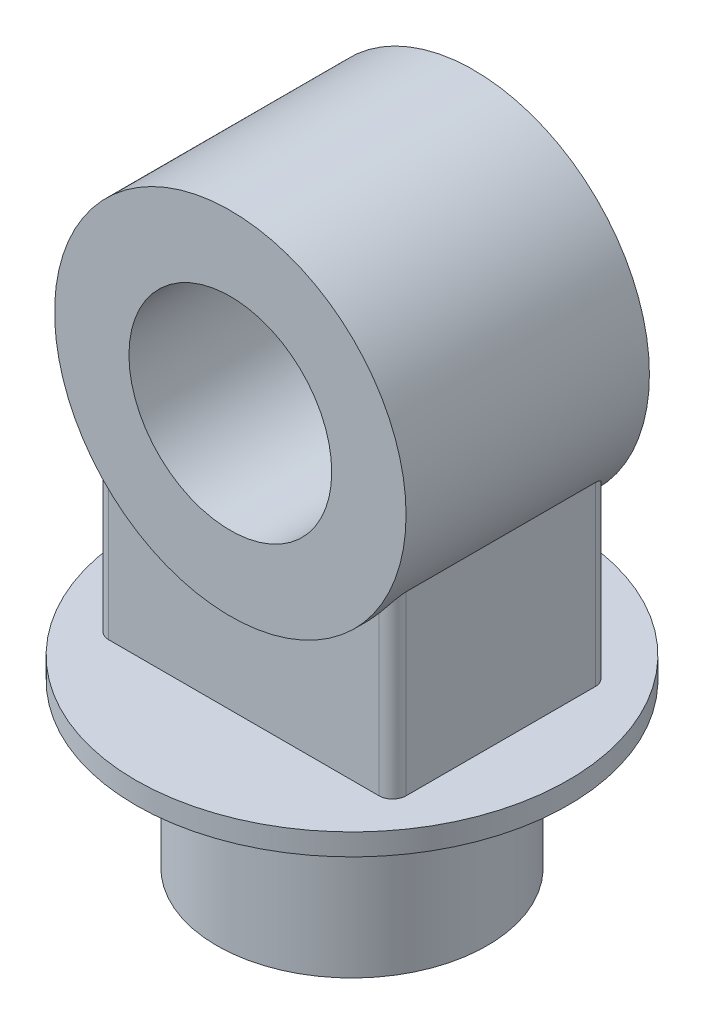
ISO-10303-21;
HEADER;
FILE_DESCRIPTION(('STEP AP214'),'2;1');
FILE_NAME('part.step','',(''),(''),'','','');
FILE_SCHEMA(('AUTOMOTIVE_DESIGN { 1 0 10303 214 1 1 1 1 }'));
ENDSEC;
DATA;
#1=APPLICATION_CONTEXT('core data for automotive mechanical design processes');
#2=APPLICATION_PROTOCOL_DEFINITION('international standard','automotive_design',2000,#1);
#3=PRODUCT_CONTEXT('',#1,'mechanical');
#4=PRODUCT('Part','Part','',(#3));
#5=PRODUCT_RELATED_PRODUCT_CATEGORY('part','',(#4));
#6=PRODUCT_DEFINITION_FORMATION('','',#4);
#7=PRODUCT_DEFINITION_CONTEXT('part definition',#1,'design');
#8=PRODUCT_DEFINITION('design','',#6,#7);
#9=PRODUCT_DEFINITION_SHAPE('','',#8);
#10=(LENGTH_UNIT() NAMED_UNIT(*) SI_UNIT(.MILLI.,.METRE.));
#11=(NAMED_UNIT(*) PLANE_ANGLE_UNIT() SI_UNIT($,.RADIAN.));
#12=(NAMED_UNIT(*) SI_UNIT($,.STERADIAN.) SOLID_ANGLE_UNIT());
#13=UNCERTAINTY_MEASURE_WITH_UNIT(LENGTH_MEASURE(1.E-05),#10,'distance_accuracy_value','');
#14=(GEOMETRIC_REPRESENTATION_CONTEXT(3) GLOBAL_UNCERTAINTY_ASSIGNED_CONTEXT((#13)) GLOBAL_UNIT_ASSIGNED_CONTEXT((#10,
#11,#12)) REPRESENTATION_CONTEXT('',''));
#15=CARTESIAN_POINT('',(0.,0.,0.));
#16=DIRECTION('',(0.,0.,1.));
#17=DIRECTION('',(1.,0.,0.));
#18=AXIS2_PLACEMENT_3D('',#15,#16,#17);
#19=CARTESIAN_POINT('',(0.,120.,0.));
#20=DIRECTION('',(0.,-1.,0.));
#21=DIRECTION('',(0.,0.,-1.));
#22=AXIS2_PLACEMENT_3D('',#19,#20,#21);
#23=CYLINDRICAL_SURFACE('',#22,100.);
#24=CARTESIAN_POINT('',(0.,120.,0.));
#25=DIRECTION('',(0.,1.,0.));
#26=DIRECTION('',(0.,0.,1.));
#27=AXIS2_PLACEMENT_3D('',#24,#25,#26);
#28=CIRCLE('',#27,100.);
#29=CARTESIAN_POINT('',(0.,120.,100.));
#30=VERTEX_POINT('',#29);
#31=EDGE_CURVE('E131',#30,#30,#28,.T.);
#32=ORIENTED_EDGE('',*,*,#31,.F.);
#33=EDGE_LOOP('',(#32));
#34=FACE_BOUND('',#33,.T.);
#35=CARTESIAN_POINT('',(0.,0.,0.));
#36=DIRECTION('',(0.,1.,0.));
#37=DIRECTION('',(0.,0.,1.));
#38=AXIS2_PLACEMENT_3D('',#35,#36,#37);
#39=CIRCLE('',#38,100.);
#40=CARTESIAN_POINT('',(0.,0.,100.));
#41=VERTEX_POINT('',#40);
#42=EDGE_CURVE('E248',#41,#41,#39,.T.);
#43=ORIENTED_EDGE('',*,*,#42,.T.);
#44=EDGE_LOOP('',(#43));
#45=FACE_BOUND('',#44,.T.);
#46=ADVANCED_FACE('F46',(#34,#45),#23,.T.);
#47=CARTESIAN_POINT('',(0.,0.,0.));
#48=DIRECTION('',(0.,1.,0.));
#49=DIRECTION('',(0.,0.,1.));
#50=AXIS2_PLACEMENT_3D('',#47,#48,#49);
#51=PLANE('',#50);
#52=ORIENTED_EDGE('',*,*,#42,.F.);
#53=EDGE_LOOP('',(#52));
#54=FACE_BOUND('',#53,.T.);
#55=ADVANCED_FACE('F201',(#54),#51,.F.);
#56=CARTESIAN_POINT('',(0.,136.,0.));
#57=DIRECTION('',(0.,-1.,0.));
#58=DIRECTION('',(0.,0.,-1.));
#59=AXIS2_PLACEMENT_3D('',#56,#57,#58);
#60=CYLINDRICAL_SURFACE('',#59,160.);
#61=CARTESIAN_POINT('',(0.,136.,0.));
#62=DIRECTION('',(0.,1.,0.));
#63=DIRECTION('',(0.,0.,1.));
#64=AXIS2_PLACEMENT_3D('',#61,#62,#63);
#65=CIRCLE('',#64,160.);
#66=CARTESIAN_POINT('',(0.,136.,160.));
#67=VERTEX_POINT('',#66);
#68=EDGE_CURVE('E252',#67,#67,#65,.T.);
#69=ORIENTED_EDGE('',*,*,#68,.F.);
#70=EDGE_LOOP('',(#69));
#71=FACE_BOUND('',#70,.T.);
#72=CARTESIAN_POINT('',(0.,120.,0.));
#73=DIRECTION('',(0.,1.,0.));
#74=DIRECTION('',(0.,0.,1.));
#75=AXIS2_PLACEMENT_3D('',#72,#73,#74);
#76=CIRCLE('',#75,160.);
#77=CARTESIAN_POINT('',(0.,120.,160.));
#78=VERTEX_POINT('',#77);
#79=EDGE_CURVE('E256',#78,#78,#76,.T.);
#80=ORIENTED_EDGE('',*,*,#79,.T.);
#81=EDGE_LOOP('',(#80));
#82=FACE_BOUND('',#81,.T.);
#83=ADVANCED_FACE('F207',(#71,#82),#60,.T.);
#84=CARTESIAN_POINT('',(0.,136.,0.));
#85=DIRECTION('',(0.,1.,0.));
#86=DIRECTION('',(0.,0.,1.));
#87=AXIS2_PLACEMENT_3D('',#84,#85,#86);
#88=PLANE('',#87);
#89=DIRECTION('',(0.,0.,-1.));
#90=VECTOR('',#89,1.);
#91=CARTESIAN_POINT('',(110.,136.,-80.));
#92=LINE('',#91,#90);
#93=CARTESIAN_POINT('',(110.,136.,70.));
#94=VERTEX_POINT('',#93);
#95=CARTESIAN_POINT('',(110.,136.,-70.));
#96=VERTEX_POINT('',#95);
#97=EDGE_CURVE('E273',#94,#96,#92,.T.);
#98=ORIENTED_EDGE('',*,*,#97,.F.);
#99=CARTESIAN_POINT('',(100.,136.,70.));
#100=DIRECTION('',(0.,1.,0.));
#101=DIRECTION('',(0.,0.,1.));
#102=AXIS2_PLACEMENT_3D('',#99,#100,#101);
#103=CIRCLE('',#102,10.);
#104=CARTESIAN_POINT('',(100.,136.,80.));
#105=VERTEX_POINT('',#104);
#106=EDGE_CURVE('E61',#94,#105,#103,.F.);
#107=ORIENTED_EDGE('',*,*,#106,.T.);
#108=DIRECTION('',(1.,0.,0.));
#109=VECTOR('',#108,1.);
#110=CARTESIAN_POINT('',(-110.,136.,80.));
#111=LINE('',#110,#109);
#112=CARTESIAN_POINT('',(-100.,136.,80.));
#113=VERTEX_POINT('',#112);
#114=EDGE_CURVE('E276',#113,#105,#111,.T.);
#115=ORIENTED_EDGE('',*,*,#114,.F.);
#116=CARTESIAN_POINT('',(-100.,136.,70.));
#117=DIRECTION('',(0.,1.,0.));
#118=DIRECTION('',(0.,0.,1.));
#119=AXIS2_PLACEMENT_3D('',#116,#117,#118);
#120=CIRCLE('',#119,10.);
#121=CARTESIAN_POINT('',(-110.,136.,70.));
#122=VERTEX_POINT('',#121);
#123=EDGE_CURVE('E150',#113,#122,#120,.F.);
#124=ORIENTED_EDGE('',*,*,#123,.T.);
#125=DIRECTION('',(0.,0.,1.));
#126=VECTOR('',#125,1.);
#127=CARTESIAN_POINT('',(-110.,136.,-80.));
#128=LINE('',#127,#126);
#129=CARTESIAN_POINT('',(-110.,136.,-70.));
#130=VERTEX_POINT('',#129);
#131=EDGE_CURVE('E126',#130,#122,#128,.T.);
#132=ORIENTED_EDGE('',*,*,#131,.F.);
#133=CARTESIAN_POINT('',(-100.,136.,-70.));
#134=DIRECTION('',(0.,1.,0.));
#135=DIRECTION('',(0.,0.,1.));
#136=AXIS2_PLACEMENT_3D('',#133,#134,#135);
#137=CIRCLE('',#136,10.);
#138=CARTESIAN_POINT('',(-100.,136.,-80.));
#139=VERTEX_POINT('',#138);
#140=EDGE_CURVE('E225',#130,#139,#137,.F.);
#141=ORIENTED_EDGE('',*,*,#140,.T.);
#142=DIRECTION('',(-1.,0.,0.));
#143=VECTOR('',#142,1.);
#144=CARTESIAN_POINT('',(-110.,136.,-80.));
#145=LINE('',#144,#143);
#146=CARTESIAN_POINT('',(100.,136.,-80.));
#147=VERTEX_POINT('',#146);
#148=EDGE_CURVE('E272',#147,#139,#145,.T.);
#149=ORIENTED_EDGE('',*,*,#148,.F.);
#150=CARTESIAN_POINT('',(100.,136.,-70.));
#151=DIRECTION('',(0.,1.,0.));
#152=DIRECTION('',(0.,0.,1.));
#153=AXIS2_PLACEMENT_3D('',#150,#151,#152);
#154=CIRCLE('',#153,10.);
#155=EDGE_CURVE('E68',#147,#96,#154,.F.);
#156=ORIENTED_EDGE('',*,*,#155,.T.);
#157=EDGE_LOOP('',(#98,#107,#115,#124,#132,#141,#149,#156));
#158=FACE_BOUND('',#157,.T.);
#159=ORIENTED_EDGE('',*,*,#68,.T.);
#160=EDGE_LOOP('',(#159));
#161=FACE_BOUND('',#160,.T.);
#162=ADVANCED_FACE('F331',(#158,#161),#88,.T.);
#163=CARTESIAN_POINT('',(0.,120.,0.));
#164=DIRECTION('',(0.,1.,0.));
#165=DIRECTION('',(0.,0.,1.));
#166=AXIS2_PLACEMENT_3D('',#163,#164,#165);
#167=PLANE('',#166);
#168=ORIENTED_EDGE('',*,*,#31,.T.);
#169=EDGE_LOOP('',(#168));
#170=FACE_BOUND('',#169,.T.);
#171=ORIENTED_EDGE('',*,*,#79,.F.);
#172=EDGE_LOOP('',(#171));
#173=FACE_BOUND('',#172,.T.);
#174=ADVANCED_FACE('F336',(#170,#173),#167,.F.);
#175=CARTESIAN_POINT('',(-110.,466.002,-80.));
#176=DIRECTION('',(0.,0.,1.));
#177=DIRECTION('',(1.,0.,0.));
#178=AXIS2_PLACEMENT_3D('',#175,#176,#177);
#179=PLANE('',#178);
#180=ORIENTED_EDGE('',*,*,#148,.T.);
#181=DIRECTION('',(0.,-1.,0.));
#182=VECTOR('',#181,1.);
#183=CARTESIAN_POINT('',(-100.,466.002,-80.));
#184=LINE('',#183,#182);
#185=CARTESIAN_POINT('',(-100.,252.933761370819,-80.));
#186=VERTEX_POINT('',#185);
#187=EDGE_CURVE('E223',#139,#186,#184,.F.);
#188=ORIENTED_EDGE('',*,*,#187,.T.);
#189=CARTESIAN_POINT('',(0.,336.,-80.));
#190=DIRECTION('',(0.,0.,1.));
#191=DIRECTION('',(1.,0.,0.));
#192=AXIS2_PLACEMENT_3D('',#189,#190,#191);
#193=CIRCLE('',#192,130.);
#194=CARTESIAN_POINT('',(100.,252.933761370819,-80.));
#195=VERTEX_POINT('',#194);
#196=EDGE_CURVE('E142',#186,#195,#193,.T.);
#197=ORIENTED_EDGE('',*,*,#196,.T.);
#198=DIRECTION('',(0.,-1.,0.));
#199=VECTOR('',#198,1.);
#200=CARTESIAN_POINT('',(100.,466.002,-80.));
#201=LINE('',#200,#199);
#202=EDGE_CURVE('E242',#195,#147,#201,.T.);
#203=ORIENTED_EDGE('',*,*,#202,.T.);
#204=EDGE_LOOP('',(#180,#188,#197,#203));
#205=FACE_BOUND('',#204,.T.);
#206=ADVANCED_FACE('F175',(#205),#179,.F.);
#207=CARTESIAN_POINT('',(-110.,466.002,-80.));
#208=DIRECTION('',(1.,0.,0.));
#209=DIRECTION('',(0.,0.,-1.));
#210=AXIS2_PLACEMENT_3D('',#207,#208,#209);
#211=PLANE('',#210);
#212=DIRECTION('',(0.,0.,1.));
#213=VECTOR('',#212,1.);
#214=CARTESIAN_POINT('',(-110.,266.717967697245,-90.));
#215=LINE('',#214,#213);
#216=CARTESIAN_POINT('',(-110.,266.717967697245,70.));
#217=VERTEX_POINT('',#216);
#218=CARTESIAN_POINT('',(-110.,266.717967697245,-70.));
#219=VERTEX_POINT('',#218);
#220=EDGE_CURVE('E123',#217,#219,#215,.F.);
#221=ORIENTED_EDGE('',*,*,#220,.T.);
#222=DIRECTION('',(0.,-1.,0.));
#223=VECTOR('',#222,1.);
#224=CARTESIAN_POINT('',(-110.,466.002,-70.));
#225=LINE('',#224,#223);
#226=EDGE_CURVE('E130',#219,#130,#225,.T.);
#227=ORIENTED_EDGE('',*,*,#226,.T.);
#228=ORIENTED_EDGE('',*,*,#131,.T.);
#229=DIRECTION('',(0.,-1.,0.));
#230=VECTOR('',#229,1.);
#231=CARTESIAN_POINT('',(-110.,466.002,70.));
#232=LINE('',#231,#230);
#233=EDGE_CURVE('E119',#122,#217,#232,.F.);
#234=ORIENTED_EDGE('',*,*,#233,.T.);
#235=EDGE_LOOP('',(#221,#227,#228,#234));
#236=FACE_BOUND('',#235,.T.);
#237=ADVANCED_FACE('F121',(#236),#211,.F.);
#238=CARTESIAN_POINT('',(110.,466.002,-80.));
#239=DIRECTION('',(-1.,0.,0.));
#240=DIRECTION('',(0.,0.,1.));
#241=AXIS2_PLACEMENT_3D('',#238,#239,#240);
#242=PLANE('',#241);
#243=ORIENTED_EDGE('',*,*,#97,.T.);
#244=DIRECTION('',(0.,-1.,0.));
#245=VECTOR('',#244,1.);
#246=CARTESIAN_POINT('',(110.,466.002,-70.));
#247=LINE('',#246,#245);
#248=CARTESIAN_POINT('',(110.,266.717967697245,-70.));
#249=VERTEX_POINT('',#248);
#250=EDGE_CURVE('E227',#96,#249,#247,.F.);
#251=ORIENTED_EDGE('',*,*,#250,.T.);
#252=DIRECTION('',(0.,0.,1.));
#253=VECTOR('',#252,1.);
#254=CARTESIAN_POINT('',(110.,266.717967697245,-90.));
#255=LINE('',#254,#253);
#256=CARTESIAN_POINT('',(110.,266.717967697245,70.));
#257=VERTEX_POINT('',#256);
#258=EDGE_CURVE('E260',#249,#257,#255,.T.);
#259=ORIENTED_EDGE('',*,*,#258,.T.);
#260=DIRECTION('',(0.,-1.,0.));
#261=VECTOR('',#260,1.);
#262=CARTESIAN_POINT('',(110.,466.002,70.));
#263=LINE('',#262,#261);
#264=EDGE_CURVE('E230',#257,#94,#263,.T.);
#265=ORIENTED_EDGE('',*,*,#264,.T.);
#266=EDGE_LOOP('',(#243,#251,#259,#265));
#267=FACE_BOUND('',#266,.T.);
#268=ADVANCED_FACE('F358',(#267),#242,.F.);
#269=CARTESIAN_POINT('',(-110.,466.002,80.));
#270=DIRECTION('',(0.,0.,-1.));
#271=DIRECTION('',(-1.,0.,0.));
#272=AXIS2_PLACEMENT_3D('',#269,#270,#271);
#273=PLANE('',#272);
#274=CARTESIAN_POINT('',(0.,336.,80.));
#275=DIRECTION('',(0.,0.,-1.));
#276=DIRECTION('',(-1.,0.,0.));
#277=AXIS2_PLACEMENT_3D('',#274,#275,#276);
#278=CIRCLE('',#277,130.);
#279=CARTESIAN_POINT('',(100.,252.933761370819,80.));
#280=VERTEX_POINT('',#279);
#281=CARTESIAN_POINT('',(-100.,252.933761370819,80.));
#282=VERTEX_POINT('',#281);
#283=EDGE_CURVE('E143',#280,#282,#278,.T.);
#284=ORIENTED_EDGE('',*,*,#283,.T.);
#285=DIRECTION('',(0.,-1.,0.));
#286=VECTOR('',#285,1.);
#287=CARTESIAN_POINT('',(-100.,466.002,80.));
#288=LINE('',#287,#286);
#289=EDGE_CURVE('E148',#282,#113,#288,.T.);
#290=ORIENTED_EDGE('',*,*,#289,.T.);
#291=ORIENTED_EDGE('',*,*,#114,.T.);
#292=DIRECTION('',(0.,-1.,0.));
#293=VECTOR('',#292,1.);
#294=CARTESIAN_POINT('',(100.,466.002,80.));
#295=LINE('',#294,#293);
#296=EDGE_CURVE('E237',#105,#280,#295,.F.);
#297=ORIENTED_EDGE('',*,*,#296,.T.);
#298=EDGE_LOOP('',(#284,#290,#291,#297));
#299=FACE_BOUND('',#298,.T.);
#300=ADVANCED_FACE('F171',(#299),#273,.F.);
#301=CARTESIAN_POINT('',(0.,336.,-90.));
#302=DIRECTION('',(0.,0.,1.));
#303=DIRECTION('',(1.,0.,0.));
#304=AXIS2_PLACEMENT_3D('',#301,#302,#303);
#305=CYLINDRICAL_SURFACE('',#304,130.);
#306=CARTESIAN_POINT('',(0.,336.,90.));
#307=DIRECTION('',(0.,0.,1.));
#308=DIRECTION('',(1.,0.,0.));
#309=AXIS2_PLACEMENT_3D('',#306,#307,#308);
#310=CIRCLE('',#309,130.);
#311=CARTESIAN_POINT('',(130.,336.,90.));
#312=VERTEX_POINT('',#311);
#313=EDGE_CURVE('E285',#312,#312,#310,.T.);
#314=ORIENTED_EDGE('',*,*,#313,.F.);
#315=EDGE_LOOP('',(#314));
#316=FACE_BOUND('',#315,.T.);
#317=CARTESIAN_POINT('',(0.,336.,-90.));
#318=DIRECTION('',(0.,0.,1.));
#319=DIRECTION('',(1.,0.,0.));
#320=AXIS2_PLACEMENT_3D('',#317,#318,#319);
#321=CIRCLE('',#320,130.);
#322=CARTESIAN_POINT('',(130.,336.,-90.));
#323=VERTEX_POINT('',#322);
#324=EDGE_CURVE('E277',#323,#323,#321,.T.);
#325=ORIENTED_EDGE('',*,*,#324,.T.);
#326=EDGE_LOOP('',(#325));
#327=FACE_BOUND('',#326,.T.);
#328=ORIENTED_EDGE('',*,*,#196,.F.);
#329=CARTESIAN_POINT('',(-100.,252.933761370819,-80.));
#330=CARTESIAN_POINT('',(-100.223611151915,253.202952503255,-79.9999830665315));
#331=CARTESIAN_POINT('',(-100.446118360057,253.473036166024,-79.9924995885084));
#332=CARTESIAN_POINT('',(-100.888548742496,254.014496760122,-79.9629173131463));
#333=CARTESIAN_POINT('',(-101.10847204376,254.285873626978,-79.9408192370115));
#334=CARTESIAN_POINT('',(-101.545586290072,254.829711400373,-79.8822979337703));
#335=CARTESIAN_POINT('',(-101.76277446753,255.102173087004,-79.8458612385231));
#336=CARTESIAN_POINT('',(-102.193849033468,255.647413797012,-79.7588609087488));
#337=CARTESIAN_POINT('',(-102.407735374993,255.920192824843,-79.7082970735217));
#338=CARTESIAN_POINT('',(-103.048408055095,256.74400885936,-79.5343891784366));
#339=CARTESIAN_POINT('',(-103.469748368072,257.294974230618,-79.3894263280957));
#340=CARTESIAN_POINT('',(-104.088382224678,258.117224843771,-79.1288060997197));
#341=CARTESIAN_POINT('',(-104.292337034927,258.39057162742,-79.0347525474724));
#342=CARTESIAN_POINT('',(-104.695498702643,258.935304765081,-78.8319429710981));
#343=CARTESIAN_POINT('',(-104.894706004332,259.206691300842,-78.7231883289499));
#344=CARTESIAN_POINT('',(-105.336170271764,259.812965668139,-78.4620472638272));
#345=CARTESIAN_POINT('',(-105.577006541077,260.147108038148,-78.3055009036512));
#346=CARTESIAN_POINT('',(-106.049660949871,260.809343252621,-77.967808626391));
#347=CARTESIAN_POINT('',(-106.281479043935,261.137436066616,-77.7866625854443));
#348=CARTESIAN_POINT('',(-106.734152264033,261.784259610706,-77.3986376161628));
#349=CARTESIAN_POINT('',(-106.955036134368,262.103013877599,-77.1918317878757));
#350=CARTESIAN_POINT('',(-107.384708325122,262.728803605627,-76.749894392022));
#351=CARTESIAN_POINT('',(-107.593501627276,263.035843875289,-76.5147746155492));
#352=CARTESIAN_POINT('',(-107.921279015409,263.522080966667,-76.1068757916445));
#353=CARTESIAN_POINT('',(-108.044709884718,263.706240813683,-75.9435605188262));
#354=CARTESIAN_POINT('',(-108.284949666933,264.066582834907,-75.6038296157537));
#355=CARTESIAN_POINT('',(-108.401760304956,264.242767084987,-75.4274174262628));
#356=CARTESIAN_POINT('',(-108.627683741988,264.585236991633,-75.0605773993746));
#357=CARTESIAN_POINT('',(-108.736797961361,264.751524473746,-74.8701521613912));
#358=CARTESIAN_POINT('',(-108.945874410432,265.071634412635,-74.4745306992527));
#359=CARTESIAN_POINT('',(-109.04583974995,265.225461102935,-74.2693395369044));
#360=CARTESIAN_POINT('',(-109.274660386151,265.579056080623,-73.7536743100226));
#361=CARTESIAN_POINT('',(-109.398046362816,265.771031349643,-73.4351396850742));
#362=CARTESIAN_POINT('',(-109.561336457207,266.026263049993,-72.9345418523035));
#363=CARTESIAN_POINT('',(-109.612072269395,266.105785634321,-72.7641622498836));
#364=CARTESIAN_POINT('',(-109.705421847597,266.25239837099,-72.4160328323222));
#365=CARTESIAN_POINT('',(-109.748040656091,266.319496241142,-72.2382876769632));
#366=CARTESIAN_POINT('',(-109.820262744001,266.433384610412,-71.8947331689276));
#367=CARTESIAN_POINT('',(-109.850752312767,266.481551609067,-71.729567610939));
#368=CARTESIAN_POINT('',(-109.903691363628,266.565274678988,-71.3948451418075));
#369=CARTESIAN_POINT('',(-109.926143541964,266.600834979285,-71.2252897238033));
#370=CARTESIAN_POINT('',(-109.962659042777,266.658707696818,-70.8807814271977));
#371=CARTESIAN_POINT('',(-109.976613864032,266.680848750137,-70.7057875562757));
#372=CARTESIAN_POINT('',(-109.99061964662,266.703076138542,-70.4419386674802));
#373=CARTESIAN_POINT('',(-109.99413386492,266.708654625172,-70.353690213971));
#374=CARTESIAN_POINT('',(-109.998824989492,266.716102079046,-70.1769662160102));
#375=CARTESIAN_POINT('',(-110.000001659485,266.717970671296,-70.088490649507));
#376=CARTESIAN_POINT('',(-110.,266.717967697245,-70.));
#377=B_SPLINE_CURVE_WITH_KNOTS('',3,(#329,#330,#331,#332,#333,#334,#335,#336,#337,#338,#339,
#340,#341,#342,#343,#344,#345,#346,#347,#348,#349,#350,#351,#352,#353,#354,#355,#356,#357,#358,
#359,#360,#361,#362,#363,#364,#365,#366,#367,#368,#369,#370,#371,#372,#373,#374,#375,#376),
.UNSPECIFIED.,.F.,.F.,(4,2,2,2,2,2,2,2,2,2,2,2,2,2,2,2,2,2,2,2,2,2,2,4),(0.,1.04974156507777,
2.09943133114574,3.15010942417271,4.20080244462032,6.32356278933855,7.38465211465328,
8.44564176134501,9.76677685539399,11.087918601761,12.4053795382949,13.7222937149078,
14.5479419827465,15.3733741023699,16.1986534888326,17.023651302289,18.194686650492,
18.7783719827905,19.3616935243416,19.8852298594993,20.4085904030381,20.9385006934629,
21.2038887699912,21.4693036704869),.UNSPECIFIED.);
#378=EDGE_CURVE('E140',#186,#219,#377,.T.);
#379=ORIENTED_EDGE('',*,*,#378,.T.);
#380=ORIENTED_EDGE('',*,*,#220,.F.);
#381=CARTESIAN_POINT('',(-110.,266.717967697245,70.));
#382=CARTESIAN_POINT('',(-110.000033683462,266.718025852698,70.1614230595313));
#383=CARTESIAN_POINT('',(-109.996092792414,266.711764254296,70.3228118197691));
#384=CARTESIAN_POINT('',(-109.980519982779,266.687045880384,70.6441123999958));
#385=CARTESIAN_POINT('',(-109.968896213713,266.668602027069,70.8040256031146));
#386=CARTESIAN_POINT('',(-109.938376398954,266.620217986395,71.1196424551221));
#387=CARTESIAN_POINT('',(-109.919558261622,266.590400967593,71.2753727040436));
#388=CARTESIAN_POINT('',(-109.875071558334,266.52000006118,71.5834085562727));
#389=CARTESIAN_POINT('',(-109.849400846184,266.479412800404,71.735713070425));
#390=CARTESIAN_POINT('',(-109.784772267017,266.377386983169,72.0722520040974));
#391=CARTESIAN_POINT('',(-109.744103525393,266.313281105856,72.2553511890568));
#392=CARTESIAN_POINT('',(-109.654040532803,266.17165023193,72.6141464391851));
#393=CARTESIAN_POINT('',(-109.604640075501,266.094115691273,72.7898371277865));
#394=CARTESIAN_POINT('',(-109.497968805892,265.927147418338,73.1338723913451));
#395=CARTESIAN_POINT('',(-109.440667457039,265.837667562915,73.302184951541));
#396=CARTESIAN_POINT('',(-109.319341126161,265.648779195145,73.6304969218558));
#397=CARTESIAN_POINT('',(-109.25531768694,265.549372961282,73.7904982269664));
#398=CARTESIAN_POINT('',(-109.085069343255,265.28590129292,74.1868876463209));
#399=CARTESIAN_POINT('',(-108.974781990569,265.115997241409,74.4176642111939));
#400=CARTESIAN_POINT('',(-108.742772943656,264.76058359918,74.8607110351427));
#401=CARTESIAN_POINT('',(-108.621044869784,264.575065307649,75.072970840064));
#402=CARTESIAN_POINT('',(-108.36794946479,264.19164129378,75.4804206329535));
#403=CARTESIAN_POINT('',(-108.236568322626,263.993717884812,75.6755852518653));
#404=CARTESIAN_POINT('',(-107.965814499919,263.588382733387,76.0497203250662));
#405=CARTESIAN_POINT('',(-107.826442440892,263.380971729107,76.2286920360202));
#406=CARTESIAN_POINT('',(-107.56145650763,262.989174407744,76.5468161797372));
#407=CARTESIAN_POINT('',(-107.436764821801,262.805791987749,76.6879854690674));
#408=CARTESIAN_POINT('',(-107.182869679799,262.434497987953,76.9599552926784));
#409=CARTESIAN_POINT('',(-107.053665586411,262.24658576965,77.0907543539386));
#410=CARTESIAN_POINT('',(-106.659844344167,261.677121003612,77.4685356621902));
#411=CARTESIAN_POINT('',(-106.389102445143,261.289965080353,77.7008024816961));
#412=CARTESIAN_POINT('',(-105.833418194947,260.504836154638,78.129863631631));
#413=CARTESIAN_POINT('',(-105.548442441802,260.106838810795,78.3265689888296));
#414=CARTESIAN_POINT('',(-104.96676628824,259.304344779382,78.6860846955172));
#415=CARTESIAN_POINT('',(-104.670068038633,258.899849292081,78.8489012287859));
#416=CARTESIAN_POINT('',(-104.024574509401,258.030646711215,79.1623550419402));
#417=CARTESIAN_POINT('',(-103.674248758637,257.565348460988,79.3081944572229));
#418=CARTESIAN_POINT('',(-102.961876677953,256.632523338709,79.558756520093));
#419=CARTESIAN_POINT('',(-102.599828734006,256.16499616738,79.6634734792563));
#420=CARTESIAN_POINT('',(-102.051092736822,255.466397204689,79.7891645729388));
#421=CARTESIAN_POINT('',(-101.868137468165,255.235094848973,79.8257282191265));
#422=CARTESIAN_POINT('',(-101.499966150616,254.77288550036,79.8886289353229));
#423=CARTESIAN_POINT('',(-101.314750133026,254.541978502041,79.9149661467555));
#424=CARTESIAN_POINT('',(-100.942320486513,254.080919722901,79.9572665465168));
#425=CARTESIAN_POINT('',(-100.755107350153,253.850767773367,79.9732322353467));
#426=CARTESIAN_POINT('',(-100.378860262163,253.391449185777,79.9945948234744));
#427=CARTESIAN_POINT('',(-100.189826234412,253.162282589497,79.9999912789888));
#428=CARTESIAN_POINT('',(-100.,252.933761370819,80.));
#429=B_SPLINE_CURVE_WITH_KNOTS('',3,(#381,#382,#383,#384,#385,#386,#387,#388,#389,#390,#391,
#392,#393,#394,#395,#396,#397,#398,#399,#400,#401,#402,#403,#404,#405,#406,#407,#408,#409,#410,
#411,#412,#413,#414,#415,#416,#417,#418,#419,#420,#421,#422,#423,#424,#425,#426,#427,#428),
.UNSPECIFIED.,.F.,.F.,(4,2,2,2,2,2,2,2,2,2,2,2,2,2,2,2,2,2,2,2,2,2,2,4),(0.,0.484045005923072,
0.967577389145415,1.44601544684505,1.92460352520314,2.51835043890467,3.11252108624073,
3.70905613988738,4.30545457926274,5.22516595363372,6.14539326092332,7.06696382284197,
7.98846280401966,8.77680092000543,9.56525081419905,11.1426900482287,12.7240229357798,
14.305067020047,16.1047501551828,17.9046821508918,18.7960435003637,19.6873925225409,
20.5785265668948,21.4696980275819),.UNSPECIFIED.);
#430=EDGE_CURVE('E137',#217,#282,#429,.T.);
#431=ORIENTED_EDGE('',*,*,#430,.T.);
#432=ORIENTED_EDGE('',*,*,#283,.F.);
#433=CARTESIAN_POINT('',(100.,252.933761370819,80.));
#434=CARTESIAN_POINT('',(100.223611151915,253.202952503255,79.9999830665315));
#435=CARTESIAN_POINT('',(100.446118360057,253.473036166024,79.9924995885085));
#436=CARTESIAN_POINT('',(100.888548742496,254.014496760122,79.9629173131463));
#437=CARTESIAN_POINT('',(101.108472043759,254.285873626978,79.9408192370116));
#438=CARTESIAN_POINT('',(101.545586290072,254.829711400373,79.8822979337704));
#439=CARTESIAN_POINT('',(101.76277446753,255.102173087004,79.8458612385232));
#440=CARTESIAN_POINT('',(102.193849033468,255.647413797012,79.7588609087488));
#441=CARTESIAN_POINT('',(102.407735374993,255.920192824843,79.7082970735218));
#442=CARTESIAN_POINT('',(103.048408055095,256.74400885936,79.5343891784367));
#443=CARTESIAN_POINT('',(103.469748368072,257.294974230618,79.3894263280958));
#444=CARTESIAN_POINT('',(104.088382224678,258.117224843771,79.1288060997198));
#445=CARTESIAN_POINT('',(104.292337034927,258.39057162742,79.0347525474725));
#446=CARTESIAN_POINT('',(104.695498702643,258.935304765081,78.8319429710982));
#447=CARTESIAN_POINT('',(104.894706004332,259.206691300842,78.7231883289499));
#448=CARTESIAN_POINT('',(105.336170271764,259.812965668139,78.4620472638273));
#449=CARTESIAN_POINT('',(105.577006541077,260.147108038148,78.3055009036513));
#450=CARTESIAN_POINT('',(106.04966094987,260.809343252621,77.967808626391));
#451=CARTESIAN_POINT('',(106.281479043935,261.137436066616,77.7866625854444));
#452=CARTESIAN_POINT('',(106.734152264033,261.784259610706,77.3986376161629));
#453=CARTESIAN_POINT('',(106.955036134368,262.103013877598,77.1918317878757));
#454=CARTESIAN_POINT('',(107.384708325122,262.728803605627,76.749894392022));
#455=CARTESIAN_POINT('',(107.593501627276,263.035843875289,76.5147746155493));
#456=CARTESIAN_POINT('',(107.921279015409,263.522080966666,76.1068757916446));
#457=CARTESIAN_POINT('',(108.044709884718,263.706240813682,75.9435605188263));
#458=CARTESIAN_POINT('',(108.284949666933,264.066582834907,75.6038296157539));
#459=CARTESIAN_POINT('',(108.401760304956,264.242767084986,75.4274174262629));
#460=CARTESIAN_POINT('',(108.627683741988,264.585236991633,75.0605773993747));
#461=CARTESIAN_POINT('',(108.736797961361,264.751524473746,74.8701521613913));
#462=CARTESIAN_POINT('',(108.945874410432,265.071634412635,74.4745306992528));
#463=CARTESIAN_POINT('',(109.04583974995,265.225461102935,74.2693395369045));
#464=CARTESIAN_POINT('',(109.274660386151,265.579056080623,73.7536743100227));
#465=CARTESIAN_POINT('',(109.398046362816,265.771031349643,73.4351396850742));
#466=CARTESIAN_POINT('',(109.561336457207,266.026263049992,72.9345418523035));
#467=CARTESIAN_POINT('',(109.612072269395,266.105785634321,72.7641622498837));
#468=CARTESIAN_POINT('',(109.705421847597,266.25239837099,72.4160328323223));
#469=CARTESIAN_POINT('',(109.748040656091,266.319496241142,72.2382876769633));
#470=CARTESIAN_POINT('',(109.820262744001,266.433384610412,71.8947331689276));
#471=CARTESIAN_POINT('',(109.850752312767,266.481551609067,71.729567610939));
#472=CARTESIAN_POINT('',(109.903691363628,266.565274678987,71.3948451418076));
#473=CARTESIAN_POINT('',(109.926143541964,266.600834979285,71.2252897238033));
#474=CARTESIAN_POINT('',(109.962659042777,266.658707696818,70.8807814271978));
#475=CARTESIAN_POINT('',(109.976613864032,266.680848750137,70.7057875562757));
#476=CARTESIAN_POINT('',(109.99061964662,266.703076138542,70.4419386674803));
#477=CARTESIAN_POINT('',(109.99413386492,266.708654625171,70.3536902139711));
#478=CARTESIAN_POINT('',(109.998824989492,266.716102079046,70.1769662160103));
#479=CARTESIAN_POINT('',(110.000001659485,266.717970671296,70.0884906495071));
#480=CARTESIAN_POINT('',(110.,266.717967697245,70.0000000000001));
#481=B_SPLINE_CURVE_WITH_KNOTS('',3,(#433,#434,#435,#436,#437,#438,#439,#440,#441,#442,#443,
#444,#445,#446,#447,#448,#449,#450,#451,#452,#453,#454,#455,#456,#457,#458,#459,#460,#461,#462,
#463,#464,#465,#466,#467,#468,#469,#470,#471,#472,#473,#474,#475,#476,#477,#478,#479,#480),
.UNSPECIFIED.,.F.,.F.,(4,2,2,2,2,2,2,2,2,2,2,2,2,2,2,2,2,2,2,2,2,2,2,4),(0.,1.04974156507776,
2.09943133114567,3.15010942417265,4.20080244462031,6.32356278933861,7.38465211465335,
8.44564176134501,9.76677685539397,11.087918601761,12.4053795382949,13.7222937149077,
14.5479419827463,15.3733741023698,16.1986534888326,17.023651302289,18.194686650492,
18.7783719827905,19.3616935243416,19.8852298594993,20.4085904030381,20.9385006934629,
21.2038887699912,21.4693036704869),.UNSPECIFIED.);
#482=EDGE_CURVE('E11',#280,#257,#481,.T.);
#483=ORIENTED_EDGE('',*,*,#482,.T.);
#484=ORIENTED_EDGE('',*,*,#258,.F.);
#485=CARTESIAN_POINT('',(110.,266.717967697245,-70.));
#486=CARTESIAN_POINT('',(110.000033683462,266.718025852698,-70.1614230595313));
#487=CARTESIAN_POINT('',(109.996092792414,266.711764254296,-70.322811819769));
#488=CARTESIAN_POINT('',(109.980519982779,266.687045880384,-70.6441123999957));
#489=CARTESIAN_POINT('',(109.968896213713,266.668602027069,-70.8040256031146));
#490=CARTESIAN_POINT('',(109.938376398954,266.620217986395,-71.119642455122));
#491=CARTESIAN_POINT('',(109.919558261622,266.590400967593,-71.2753727040436));
#492=CARTESIAN_POINT('',(109.875071558334,266.52000006118,-71.5834085562726));
#493=CARTESIAN_POINT('',(109.849400846184,266.479412800404,-71.7357130704249));
#494=CARTESIAN_POINT('',(109.784772267017,266.377386983169,-72.0722520040974));
#495=CARTESIAN_POINT('',(109.744103525393,266.313281105856,-72.2553511890568));
#496=CARTESIAN_POINT('',(109.654040532803,266.17165023193,-72.6141464391851));
#497=CARTESIAN_POINT('',(109.604640075501,266.094115691273,-72.7898371277865));
#498=CARTESIAN_POINT('',(109.497968805892,265.927147418338,-73.133872391345));
#499=CARTESIAN_POINT('',(109.440667457039,265.837667562915,-73.302184951541));
#500=CARTESIAN_POINT('',(109.319341126161,265.648779195145,-73.6304969218558));
#501=CARTESIAN_POINT('',(109.25531768694,265.549372961282,-73.7904982269664));
#502=CARTESIAN_POINT('',(109.085069343255,265.28590129292,-74.1868876463209));
#503=CARTESIAN_POINT('',(108.974781990569,265.115997241409,-74.4176642111939));
#504=CARTESIAN_POINT('',(108.742772943656,264.76058359918,-74.8607110351426));
#505=CARTESIAN_POINT('',(108.621044869784,264.575065307649,-75.072970840064));
#506=CARTESIAN_POINT('',(108.36794946479,264.19164129378,-75.4804206329535));
#507=CARTESIAN_POINT('',(108.236568322626,263.993717884812,-75.6755852518652));
#508=CARTESIAN_POINT('',(107.965814499919,263.588382733387,-76.0497203250661));
#509=CARTESIAN_POINT('',(107.826442440892,263.380971729107,-76.2286920360201));
#510=CARTESIAN_POINT('',(107.56145650763,262.989174407744,-76.5468161797372));
#511=CARTESIAN_POINT('',(107.436764821801,262.805791987749,-76.6879854690673));
#512=CARTESIAN_POINT('',(107.182869679799,262.434497987953,-76.9599552926783));
#513=CARTESIAN_POINT('',(107.053665586411,262.24658576965,-77.0907543539386));
#514=CARTESIAN_POINT('',(106.659844344167,261.677121003612,-77.4685356621901));
#515=CARTESIAN_POINT('',(106.389102445143,261.289965080353,-77.700802481696));
#516=CARTESIAN_POINT('',(105.833418194947,260.504836154638,-78.1298636316309));
#517=CARTESIAN_POINT('',(105.548442441802,260.106838810795,-78.3265689888295));
#518=CARTESIAN_POINT('',(104.96676628824,259.304344779382,-78.6860846955171));
#519=CARTESIAN_POINT('',(104.670068038633,258.899849292081,-78.8489012287858));
#520=CARTESIAN_POINT('',(104.024574509401,258.030646711215,-79.1623550419402));
#521=CARTESIAN_POINT('',(103.674248758637,257.565348460988,-79.3081944572228));
#522=CARTESIAN_POINT('',(102.961876677953,256.632523338709,-79.5587565200929));
#523=CARTESIAN_POINT('',(102.599828734006,256.16499616738,-79.6634734792563));
#524=CARTESIAN_POINT('',(102.051092736822,255.466397204689,-79.7891645729387));
#525=CARTESIAN_POINT('',(101.868137468165,255.235094848973,-79.8257282191264));
#526=CARTESIAN_POINT('',(101.499966150616,254.77288550036,-79.8886289353229));
#527=CARTESIAN_POINT('',(101.314750133026,254.541978502041,-79.9149661467554));
#528=CARTESIAN_POINT('',(100.942320486513,254.080919722901,-79.9572665465167));
#529=CARTESIAN_POINT('',(100.755107350153,253.850767773367,-79.9732322353467));
#530=CARTESIAN_POINT('',(100.378860262163,253.391449185777,-79.9945948234743));
#531=CARTESIAN_POINT('',(100.189826234412,253.162282589497,-79.9999912789887));
#532=CARTESIAN_POINT('',(100.,252.933761370819,-80.));
#533=B_SPLINE_CURVE_WITH_KNOTS('',3,(#485,#486,#487,#488,#489,#490,#491,#492,#493,#494,#495,
#496,#497,#498,#499,#500,#501,#502,#503,#504,#505,#506,#507,#508,#509,#510,#511,#512,#513,#514,
#515,#516,#517,#518,#519,#520,#521,#522,#523,#524,#525,#526,#527,#528,#529,#530,#531,#532),
.UNSPECIFIED.,.F.,.F.,(4,2,2,2,2,2,2,2,2,2,2,2,2,2,2,2,2,2,2,2,2,2,2,4),(0.,0.484045005923069,
0.96757738914542,1.44601544684505,1.92460352520313,2.51835043890468,3.11252108624078,
3.7090561398874,4.30545457926274,5.22516595363375,6.14539326092329,7.06696382284192,
7.98846280401964,8.77680092000536,9.56525081419895,11.1426900482287,12.7240229357798,
14.305067020047,16.1047501551828,17.9046821508917,18.7960435003637,19.6873925225409,
20.5785265668947,21.4696980275819),.UNSPECIFIED.);
#534=EDGE_CURVE('E154',#249,#195,#533,.T.);
#535=ORIENTED_EDGE('',*,*,#534,.T.);
#536=EDGE_LOOP('',(#328,#379,#380,#431,#432,#483,#484,#535));
#537=FACE_BOUND('',#536,.T.);
#538=ADVANCED_FACE('F135',(#316,#327,#537),#305,.T.);
#539=CARTESIAN_POINT('',(0.,336.,-90.));
#540=DIRECTION('',(0.,0.,1.));
#541=DIRECTION('',(1.,0.,0.));
#542=AXIS2_PLACEMENT_3D('',#539,#540,#541);
#543=PLANE('',#542);
#544=CARTESIAN_POINT('',(0.,336.,-90.));
#545=DIRECTION('',(0.,0.,1.));
#546=DIRECTION('',(1.,0.,0.));
#547=AXIS2_PLACEMENT_3D('',#544,#545,#546);
#548=CIRCLE('',#547,75.);
#549=CARTESIAN_POINT('',(75.,336.,-90.));
#550=VERTEX_POINT('',#549);
#551=EDGE_CURVE('E289',#550,#550,#548,.T.);
#552=ORIENTED_EDGE('',*,*,#551,.T.);
#553=EDGE_LOOP('',(#552));
#554=FACE_BOUND('',#553,.T.);
#555=ORIENTED_EDGE('',*,*,#324,.F.);
#556=EDGE_LOOP('',(#555));
#557=FACE_BOUND('',#556,.T.);
#558=ADVANCED_FACE('F170',(#554,#557),#543,.F.);
#559=CARTESIAN_POINT('',(0.,336.,90.));
#560=DIRECTION('',(0.,0.,1.));
#561=DIRECTION('',(1.,0.,0.));
#562=AXIS2_PLACEMENT_3D('',#559,#560,#561);
#563=PLANE('',#562);
#564=CARTESIAN_POINT('',(0.,336.,90.));
#565=DIRECTION('',(0.,0.,1.));
#566=DIRECTION('',(1.,0.,0.));
#567=AXIS2_PLACEMENT_3D('',#564,#565,#566);
#568=CIRCLE('',#567,75.);
#569=CARTESIAN_POINT('',(75.,336.,90.));
#570=VERTEX_POINT('',#569);
#571=EDGE_CURVE('E293',#570,#570,#568,.T.);
#572=ORIENTED_EDGE('',*,*,#571,.F.);
#573=EDGE_LOOP('',(#572));
#574=FACE_BOUND('',#573,.T.);
#575=ORIENTED_EDGE('',*,*,#313,.T.);
#576=EDGE_LOOP('',(#575));
#577=FACE_BOUND('',#576,.T.);
#578=ADVANCED_FACE('F173',(#574,#577),#563,.T.);
#579=CARTESIAN_POINT('',(0.,336.,-90.));
#580=DIRECTION('',(0.,0.,1.));
#581=DIRECTION('',(1.,0.,0.));
#582=AXIS2_PLACEMENT_3D('',#579,#580,#581);
#583=CYLINDRICAL_SURFACE('',#582,75.);
#584=CARTESIAN_POINT('',(75.,336.,-90.));
#585=CARTESIAN_POINT('',(75.,336.,-88.125));
#586=CARTESIAN_POINT('',(75.,336.,-86.25));
#587=CARTESIAN_POINT('',(75.,336.,-82.5));
#588=CARTESIAN_POINT('',(75.,336.,-80.625));
#589=CARTESIAN_POINT('',(75.,336.,-76.875));
#590=CARTESIAN_POINT('',(75.,336.,-75.));
#591=CARTESIAN_POINT('',(75.,336.,-71.25));
#592=CARTESIAN_POINT('',(75.,336.,-69.375));
#593=CARTESIAN_POINT('',(75.,336.,-65.625));
#594=CARTESIAN_POINT('',(75.,336.,-63.75));
#595=CARTESIAN_POINT('',(75.,336.,-60.));
#596=CARTESIAN_POINT('',(75.,336.,-58.125));
#597=CARTESIAN_POINT('',(75.,336.,-54.375));
#598=CARTESIAN_POINT('',(75.,336.,-52.5));
#599=CARTESIAN_POINT('',(75.,336.,-48.75));
#600=CARTESIAN_POINT('',(75.,336.,-46.875));
#601=CARTESIAN_POINT('',(75.,336.,-43.125));
#602=CARTESIAN_POINT('',(75.,336.,-41.25));
#603=CARTESIAN_POINT('',(75.,336.,-37.5));
#604=CARTESIAN_POINT('',(75.,336.,-35.625));
#605=CARTESIAN_POINT('',(75.,336.,-31.875));
#606=CARTESIAN_POINT('',(75.,336.,-30.));
#607=CARTESIAN_POINT('',(75.,336.,-26.25));
#608=CARTESIAN_POINT('',(75.,336.,-24.375));
#609=CARTESIAN_POINT('',(75.,336.,-20.625));
#610=CARTESIAN_POINT('',(75.,336.,-18.75));
#611=CARTESIAN_POINT('',(75.,336.,-15.));
#612=CARTESIAN_POINT('',(75.,336.,-13.125));
#613=CARTESIAN_POINT('',(75.,336.,-9.37500000000003));
#614=CARTESIAN_POINT('',(75.,336.,-7.50000000000003));
#615=CARTESIAN_POINT('',(75.,336.,-3.75000000000003));
#616=CARTESIAN_POINT('',(75.,336.,-1.87500000000003));
#617=CARTESIAN_POINT('',(75.,336.,1.87499999999997));
#618=CARTESIAN_POINT('',(75.,336.,3.74999999999998));
#619=CARTESIAN_POINT('',(75.,336.,7.49999999999997));
#620=CARTESIAN_POINT('',(75.,336.,9.37499999999997));
#621=CARTESIAN_POINT('',(75.,336.,13.125));
#622=CARTESIAN_POINT('',(75.,336.,15.));
#623=CARTESIAN_POINT('',(75.,336.,18.75));
#624=CARTESIAN_POINT('',(75.,336.,20.625));
#625=CARTESIAN_POINT('',(75.,336.,24.375));
#626=CARTESIAN_POINT('',(75.,336.,26.25));
#627=CARTESIAN_POINT('',(75.,336.,30.));
#628=CARTESIAN_POINT('',(75.,336.,31.875));
#629=CARTESIAN_POINT('',(75.,336.,35.625));
#630=CARTESIAN_POINT('',(75.,336.,37.5));
#631=CARTESIAN_POINT('',(75.,336.,41.25));
#632=CARTESIAN_POINT('',(75.,336.,43.125));
#633=CARTESIAN_POINT('',(75.,336.,46.875));
#634=CARTESIAN_POINT('',(75.,336.,48.75));
#635=CARTESIAN_POINT('',(75.,336.,52.5));
#636=CARTESIAN_POINT('',(75.,336.,54.375));
#637=CARTESIAN_POINT('',(75.,336.,58.125));
#638=CARTESIAN_POINT('',(75.,336.,60.));
#639=CARTESIAN_POINT('',(75.,336.,63.75));
#640=CARTESIAN_POINT('',(75.,336.,65.625));
#641=CARTESIAN_POINT('',(75.,336.,69.375));
#642=CARTESIAN_POINT('',(75.,336.,71.25));
#643=CARTESIAN_POINT('',(75.,336.,75.));
#644=CARTESIAN_POINT('',(75.,336.,76.875));
#645=CARTESIAN_POINT('',(75.,336.,80.625));
#646=CARTESIAN_POINT('',(75.,336.,82.5));
#647=CARTESIAN_POINT('',(75.,336.,86.25));
#648=CARTESIAN_POINT('',(75.,336.,88.125));
#649=CARTESIAN_POINT('',(75.,336.,90.));
#650=B_SPLINE_CURVE_WITH_KNOTS('',3,(#584,#585,#586,#587,#588,#589,#590,#591,#592,#593,#594,
#595,#596,#597,#598,#599,#600,#601,#602,#603,#604,#605,#606,#607,#608,#609,#610,#611,#612,#613,
#614,#615,#616,#617,#618,#619,#620,#621,#622,#623,#624,#625,#626,#627,#628,#629,#630,#631,#632,
#633,#634,#635,#636,#637,#638,#639,#640,#641,#642,#643,#644,#645,#646,#647,#648,#649),
.UNSPECIFIED.,.F.,.F.,(4,2,2,2,2,2,2,2,2,2,2,2,2,2,2,2,2,2,2,2,2,2,2,2,2,2,2,2,2,2,2,2,4),(0.,
5.62500000000001,11.25,16.875,22.5,28.125,33.75,39.375,45.,50.625,56.25,61.875,67.5,73.125,
78.75,84.375,90.,95.625,101.25,106.875,112.5,118.125,123.75,129.375,135.,140.625,146.25,151.875,
157.5,163.125,168.75,174.375,180.),.UNSPECIFIED.);
#651=EDGE_CURVE('BSEAM215',#550,#570,#650,.T.);
#652=ORIENTED_EDGE('',*,*,#551,.F.);
#653=ORIENTED_EDGE('',*,*,#571,.T.);
#654=ORIENTED_EDGE('',*,*,#651,.T.);
#655=ORIENTED_EDGE('',*,*,#651,.F.);
#656=EDGE_LOOP('',(#652,#654,#653,#655));
#657=FACE_BOUND('',#656,.T.);
#658=ADVANCED_FACE('F215',(#657),#583,.F.);
#659=CARTESIAN_POINT('',(-100.,466.002,-70.));
#660=DIRECTION('',(0.,-1.,0.));
#661=DIRECTION('',(0.,0.,-1.));
#662=AXIS2_PLACEMENT_3D('',#659,#660,#661);
#663=CYLINDRICAL_SURFACE('',#662,10.);
#664=ORIENTED_EDGE('',*,*,#378,.F.);
#665=ORIENTED_EDGE('',*,*,#187,.F.);
#666=ORIENTED_EDGE('',*,*,#140,.F.);
#667=ORIENTED_EDGE('',*,*,#226,.F.);
#668=EDGE_LOOP('',(#664,#665,#666,#667));
#669=FACE_BOUND('',#668,.T.);
#670=ADVANCED_FACE('F198',(#669),#663,.T.);
#671=CARTESIAN_POINT('',(-100.,466.002,70.));
#672=DIRECTION('',(0.,-1.,0.));
#673=DIRECTION('',(0.,0.,-1.));
#674=AXIS2_PLACEMENT_3D('',#671,#672,#673);
#675=CYLINDRICAL_SURFACE('',#674,10.);
#676=ORIENTED_EDGE('',*,*,#430,.F.);
#677=ORIENTED_EDGE('',*,*,#233,.F.);
#678=ORIENTED_EDGE('',*,*,#123,.F.);
#679=ORIENTED_EDGE('',*,*,#289,.F.);
#680=EDGE_LOOP('',(#676,#677,#678,#679));
#681=FACE_BOUND('',#680,.T.);
#682=ADVANCED_FACE('F146',(#681),#675,.T.);
#683=CARTESIAN_POINT('',(100.,466.002,-70.));
#684=DIRECTION('',(0.,-1.,0.));
#685=DIRECTION('',(0.,0.,-1.));
#686=AXIS2_PLACEMENT_3D('',#683,#684,#685);
#687=CYLINDRICAL_SURFACE('',#686,10.);
#688=ORIENTED_EDGE('',*,*,#534,.F.);
#689=ORIENTED_EDGE('',*,*,#250,.F.);
#690=ORIENTED_EDGE('',*,*,#155,.F.);
#691=ORIENTED_EDGE('',*,*,#202,.F.);
#692=EDGE_LOOP('',(#688,#689,#690,#691));
#693=FACE_BOUND('',#692,.T.);
#694=ADVANCED_FACE('F190',(#693),#687,.T.);
#695=CARTESIAN_POINT('',(100.,466.002,70.));
#696=DIRECTION('',(0.,-1.,0.));
#697=DIRECTION('',(0.,0.,-1.));
#698=AXIS2_PLACEMENT_3D('',#695,#696,#697);
#699=CYLINDRICAL_SURFACE('',#698,10.);
#700=ORIENTED_EDGE('',*,*,#482,.F.);
#701=ORIENTED_EDGE('',*,*,#296,.F.);
#702=ORIENTED_EDGE('',*,*,#106,.F.);
#703=ORIENTED_EDGE('',*,*,#264,.F.);
#704=EDGE_LOOP('',(#700,#701,#702,#703));
#705=FACE_BOUND('',#704,.T.);
#706=ADVANCED_FACE('F48',(#705),#699,.T.);
#707=CLOSED_SHELL('',(#46,#55,#83,#162,#174,#206,#237,#268,#300,#538,#558,#578,#658,#670,#682,
#694,#706));
#708=MANIFOLD_SOLID_BREP('B2',#707);
#709=ADVANCED_BREP_SHAPE_REPRESENTATION('',(#18,#708),#14);
#710=SHAPE_DEFINITION_REPRESENTATION(#9,#709);
ENDSEC;
END-ISO-10303-21;
